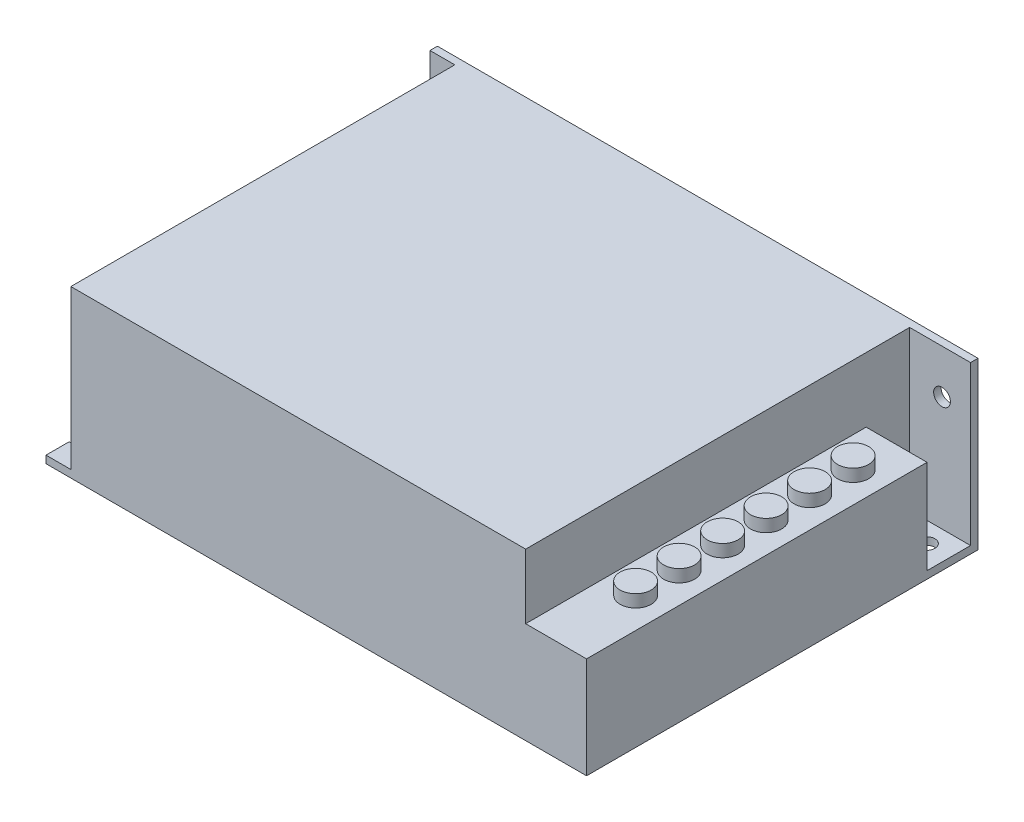
ISO-10303-21;
HEADER;
FILE_DESCRIPTION(('STEP AP214'),'2;1');
FILE_NAME('part.step','',(''),(''),'','','');
FILE_SCHEMA(('AUTOMOTIVE_DESIGN { 1 0 10303 214 1 1 1 1 }'));
ENDSEC;
DATA;
#1=APPLICATION_CONTEXT('core data for automotive mechanical design processes');
#2=APPLICATION_PROTOCOL_DEFINITION('international standard','automotive_design',2000,#1);
#3=PRODUCT_CONTEXT('',#1,'mechanical');
#4=PRODUCT('Part','Part','',(#3));
#5=PRODUCT_RELATED_PRODUCT_CATEGORY('part','',(#4));
#6=PRODUCT_DEFINITION_FORMATION('','',#4);
#7=PRODUCT_DEFINITION_CONTEXT('part definition',#1,'design');
#8=PRODUCT_DEFINITION('design','',#6,#7);
#9=PRODUCT_DEFINITION_SHAPE('','',#8);
#10=(LENGTH_UNIT() NAMED_UNIT(*) SI_UNIT(.MILLI.,.METRE.));
#11=(NAMED_UNIT(*) PLANE_ANGLE_UNIT() SI_UNIT($,.RADIAN.));
#12=(NAMED_UNIT(*) SI_UNIT($,.STERADIAN.) SOLID_ANGLE_UNIT());
#13=UNCERTAINTY_MEASURE_WITH_UNIT(LENGTH_MEASURE(1.E-05),#10,'distance_accuracy_value','');
#14=(GEOMETRIC_REPRESENTATION_CONTEXT(3) GLOBAL_UNCERTAINTY_ASSIGNED_CONTEXT((#13)) GLOBAL_UNIT_ASSIGNED_CONTEXT((#10,
#11,#12)) REPRESENTATION_CONTEXT('',''));
#15=CARTESIAN_POINT('',(0.,0.,0.));
#16=DIRECTION('',(0.,0.,1.));
#17=DIRECTION('',(1.,0.,0.));
#18=AXIS2_PLACEMENT_3D('',#15,#16,#17);
#19=CARTESIAN_POINT('',(0.,20.701,0.));
#20=DIRECTION('',(0.,1.,0.));
#21=DIRECTION('',(0.,0.,1.));
#22=AXIS2_PLACEMENT_3D('',#19,#20,#21);
#23=PLANE('',#22);
#24=CARTESIAN_POINT('',(49.022,20.701,-20.701));
#25=DIRECTION('',(0.,1.,0.));
#26=DIRECTION('',(0.,0.,1.));
#27=AXIS2_PLACEMENT_3D('',#24,#25,#26);
#28=CIRCLE('',#27,3.175);
#29=CARTESIAN_POINT('',(49.022,20.701,-17.526));
#30=VERTEX_POINT('',#29);
#31=EDGE_CURVE('E213',#30,#30,#28,.T.);
#32=ORIENTED_EDGE('',*,*,#31,.F.);
#33=EDGE_LOOP('',(#32));
#34=FACE_BOUND('',#33,.T.);
#35=DIRECTION('',(1.,0.,0.));
#36=VECTOR('',#35,1.);
#37=CARTESIAN_POINT('',(21.6616059080122,20.701,-29.591));
#38=LINE('',#37,#36);
#39=CARTESIAN_POINT('',(42.799,20.701,-29.591));
#40=VERTEX_POINT('',#39);
#41=CARTESIAN_POINT('',(55.245,20.701,-29.591));
#42=VERTEX_POINT('',#41);
#43=EDGE_CURVE('E313',#40,#42,#38,.T.);
#44=ORIENTED_EDGE('',*,*,#43,.F.);
#45=DIRECTION('',(0.,0.,1.));
#46=VECTOR('',#45,1.);
#47=CARTESIAN_POINT('',(42.799,20.701,-38.481));
#48=LINE('',#47,#46);
#49=CARTESIAN_POINT('',(42.799,20.701,40.005));
#50=VERTEX_POINT('',#49);
#51=EDGE_CURVE('E329',#40,#50,#48,.T.);
#52=ORIENTED_EDGE('',*,*,#51,.T.);
#53=DIRECTION('',(1.,0.,0.));
#54=VECTOR('',#53,1.);
#55=CARTESIAN_POINT('',(42.799,20.701,40.005));
#56=LINE('',#55,#54);
#57=CARTESIAN_POINT('',(55.245,20.701,40.005));
#58=VERTEX_POINT('',#57);
#59=EDGE_CURVE('E331',#50,#58,#56,.T.);
#60=ORIENTED_EDGE('',*,*,#59,.T.);
#61=DIRECTION('',(0.,0.,-1.));
#62=VECTOR('',#61,1.);
#63=CARTESIAN_POINT('',(55.245,20.701,-38.481));
#64=LINE('',#63,#62);
#65=EDGE_CURVE('E334',#58,#42,#64,.T.);
#66=ORIENTED_EDGE('',*,*,#65,.T.);
#67=EDGE_LOOP('',(#44,#52,#60,#66));
#68=FACE_BOUND('',#67,.T.);
#69=CARTESIAN_POINT('',(49.022,20.701,-11.811));
#70=DIRECTION('',(0.,1.,0.));
#71=DIRECTION('',(0.,0.,1.));
#72=AXIS2_PLACEMENT_3D('',#69,#70,#71);
#73=CIRCLE('',#72,3.175);
#74=CARTESIAN_POINT('',(49.022,20.701,-8.63600000000002));
#75=VERTEX_POINT('',#74);
#76=EDGE_CURVE('E207',#75,#75,#73,.T.);
#77=ORIENTED_EDGE('',*,*,#76,.F.);
#78=EDGE_LOOP('',(#77));
#79=FACE_BOUND('',#78,.T.);
#80=CARTESIAN_POINT('',(49.022,20.701,-2.92100000000002));
#81=DIRECTION('',(0.,1.,0.));
#82=DIRECTION('',(0.,0.,1.));
#83=AXIS2_PLACEMENT_3D('',#80,#81,#82);
#84=CIRCLE('',#83,3.175);
#85=CARTESIAN_POINT('',(49.022,20.701,0.253999999999977));
#86=VERTEX_POINT('',#85);
#87=EDGE_CURVE('E392',#86,#86,#84,.T.);
#88=ORIENTED_EDGE('',*,*,#87,.F.);
#89=EDGE_LOOP('',(#88));
#90=FACE_BOUND('',#89,.T.);
#91=CARTESIAN_POINT('',(49.022,20.701,5.96899999999998));
#92=DIRECTION('',(0.,1.,0.));
#93=DIRECTION('',(0.,0.,1.));
#94=AXIS2_PLACEMENT_3D('',#91,#92,#93);
#95=CIRCLE('',#94,3.175);
#96=CARTESIAN_POINT('',(49.022,20.701,9.14399999999998));
#97=VERTEX_POINT('',#96);
#98=EDGE_CURVE('E398',#97,#97,#95,.T.);
#99=ORIENTED_EDGE('',*,*,#98,.F.);
#100=EDGE_LOOP('',(#99));
#101=FACE_BOUND('',#100,.T.);
#102=CARTESIAN_POINT('',(49.022,20.701,14.859));
#103=DIRECTION('',(0.,1.,0.));
#104=DIRECTION('',(0.,0.,1.));
#105=AXIS2_PLACEMENT_3D('',#102,#103,#104);
#106=CIRCLE('',#105,3.175);
#107=CARTESIAN_POINT('',(49.022,20.701,18.034));
#108=VERTEX_POINT('',#107);
#109=EDGE_CURVE('E404',#108,#108,#106,.T.);
#110=ORIENTED_EDGE('',*,*,#109,.F.);
#111=EDGE_LOOP('',(#110));
#112=FACE_BOUND('',#111,.T.);
#113=CARTESIAN_POINT('',(49.022,20.701,23.749));
#114=DIRECTION('',(0.,1.,0.));
#115=DIRECTION('',(0.,0.,1.));
#116=AXIS2_PLACEMENT_3D('',#113,#114,#115);
#117=CIRCLE('',#116,3.175);
#118=CARTESIAN_POINT('',(49.022,20.701,26.924));
#119=VERTEX_POINT('',#118);
#120=EDGE_CURVE('E40',#119,#119,#117,.T.);
#121=ORIENTED_EDGE('',*,*,#120,.F.);
#122=EDGE_LOOP('',(#121));
#123=FACE_BOUND('',#122,.T.);
#124=ADVANCED_FACE('F32',(#34,#68,#79,#90,#101,#112,#123),#23,.T.);
#125=CARTESIAN_POINT('',(-55.245,33.909,-40.005));
#126=DIRECTION('',(1.,0.,0.));
#127=DIRECTION('',(0.,0.,-1.));
#128=AXIS2_PLACEMENT_3D('',#125,#126,#127);
#129=PLANE('',#128);
#130=DIRECTION('',(0.,0.,1.));
#131=VECTOR('',#130,1.);
#132=CARTESIAN_POINT('',(-55.245,0.,-40.005));
#133=LINE('',#132,#131);
#134=CARTESIAN_POINT('',(-55.245,0.,-40.005));
#135=VERTEX_POINT('',#134);
#136=CARTESIAN_POINT('',(-55.245,0.,32.1056));
#137=VERTEX_POINT('',#136);
#138=EDGE_CURVE('E366',#135,#137,#133,.T.);
#139=ORIENTED_EDGE('',*,*,#138,.T.);
#140=DIRECTION('',(0.,-1.,0.));
#141=VECTOR('',#140,1.);
#142=CARTESIAN_POINT('',(-55.245,33.909,32.1056));
#143=LINE('',#142,#141);
#144=CARTESIAN_POINT('',(-55.245,1.524,32.1056));
#145=VERTEX_POINT('',#144);
#146=EDGE_CURVE('E231',#145,#137,#143,.T.);
#147=ORIENTED_EDGE('',*,*,#146,.F.);
#148=DIRECTION('',(0.,0.,1.));
#149=VECTOR('',#148,1.);
#150=CARTESIAN_POINT('',(-55.245,1.524,29.845));
#151=LINE('',#150,#149);
#152=CARTESIAN_POINT('',(-55.245,1.524,29.845));
#153=VERTEX_POINT('',#152);
#154=EDGE_CURVE('E271',#153,#145,#151,.T.);
#155=ORIENTED_EDGE('',*,*,#154,.F.);
#156=DIRECTION('',(0.,-1.,0.));
#157=VECTOR('',#156,1.);
#158=CARTESIAN_POINT('',(-55.245,13.462,29.845));
#159=LINE('',#158,#157);
#160=CARTESIAN_POINT('',(-55.245,13.462,29.845));
#161=VERTEX_POINT('',#160);
#162=EDGE_CURVE('E292',#161,#153,#159,.T.);
#163=ORIENTED_EDGE('',*,*,#162,.F.);
#164=DIRECTION('',(0.,0.,1.));
#165=VECTOR('',#164,1.);
#166=CARTESIAN_POINT('',(-55.245,13.462,-38.481));
#167=LINE('',#166,#165);
#168=CARTESIAN_POINT('',(-55.245,13.462,-38.481));
#169=VERTEX_POINT('',#168);
#170=EDGE_CURVE('E289',#169,#161,#167,.T.);
#171=ORIENTED_EDGE('',*,*,#170,.F.);
#172=DIRECTION('',(0.,-1.,0.));
#173=VECTOR('',#172,1.);
#174=CARTESIAN_POINT('',(-55.245,33.909,-38.481));
#175=LINE('',#174,#173);
#176=CARTESIAN_POINT('',(-55.245,23.2918,-38.481));
#177=VERTEX_POINT('',#176);
#178=EDGE_CURVE('E266',#177,#169,#175,.T.);
#179=ORIENTED_EDGE('',*,*,#178,.F.);
#180=DIRECTION('',(0.,0.,-1.));
#181=VECTOR('',#180,1.);
#182=CARTESIAN_POINT('',(-55.245,23.2918,40.006));
#183=LINE('',#182,#181);
#184=CARTESIAN_POINT('',(-55.245,23.2918,-40.005));
#185=VERTEX_POINT('',#184);
#186=EDGE_CURVE('E55',#177,#185,#183,.T.);
#187=ORIENTED_EDGE('',*,*,#186,.T.);
#188=DIRECTION('',(0.,-1.,0.));
#189=VECTOR('',#188,1.);
#190=CARTESIAN_POINT('',(-55.245,33.909,-40.005));
#191=LINE('',#190,#189);
#192=EDGE_CURVE('E375',#185,#135,#191,.T.);
#193=ORIENTED_EDGE('',*,*,#192,.T.);
#194=EDGE_LOOP('',(#139,#147,#155,#163,#171,#179,#187,#193));
#195=FACE_BOUND('',#194,.T.);
#196=ADVANCED_FACE('F415',(#195),#129,.F.);
#197=CARTESIAN_POINT('',(-55.245,33.909,-40.005));
#198=VERTEX_POINT('',#197);
#199=CARTESIAN_POINT('',(-55.245,26.543,-40.005));
#200=VERTEX_POINT('',#199);
#201=EDGE_CURVE('E376',#198,#200,#191,.T.);
#202=ORIENTED_EDGE('',*,*,#201,.T.);
#203=DIRECTION('',(0.,0.,-1.));
#204=VECTOR('',#203,1.);
#205=CARTESIAN_POINT('',(-55.245,26.543,40.006));
#206=LINE('',#205,#204);
#207=CARTESIAN_POINT('',(-55.245,26.543,-38.481));
#208=VERTEX_POINT('',#207);
#209=EDGE_CURVE('E255',#208,#200,#206,.T.);
#210=ORIENTED_EDGE('',*,*,#209,.F.);
#211=CARTESIAN_POINT('',(-55.245,33.909,-38.481));
#212=VERTEX_POINT('',#211);
#213=EDGE_CURVE('E286',#212,#208,#175,.T.);
#214=ORIENTED_EDGE('',*,*,#213,.F.);
#215=DIRECTION('',(0.,0.,1.));
#216=VECTOR('',#215,1.);
#217=CARTESIAN_POINT('',(-55.245,33.909,-40.005));
#218=LINE('',#217,#216);
#219=EDGE_CURVE('E354',#198,#212,#218,.T.);
#220=ORIENTED_EDGE('',*,*,#219,.F.);
#221=EDGE_LOOP('',(#202,#210,#214,#220));
#222=FACE_BOUND('',#221,.T.);
#223=ADVANCED_FACE('F421',(#222),#129,.F.);
#224=CARTESIAN_POINT('',(55.245,33.909,-40.005));
#225=DIRECTION('',(-1.,0.,0.));
#226=DIRECTION('',(0.,0.,1.));
#227=AXIS2_PLACEMENT_3D('',#224,#225,#226);
#228=PLANE('',#227);
#229=DIRECTION('',(0.,0.,-1.));
#230=VECTOR('',#229,1.);
#231=CARTESIAN_POINT('',(55.245,1.524,-38.481));
#232=LINE('',#231,#230);
#233=CARTESIAN_POINT('',(55.245,1.524,-29.591));
#234=VERTEX_POINT('',#233);
#235=CARTESIAN_POINT('',(55.245,1.524,-38.481));
#236=VERTEX_POINT('',#235);
#237=EDGE_CURVE('E310',#234,#236,#232,.T.);
#238=ORIENTED_EDGE('',*,*,#237,.F.);
#239=DIRECTION('',(0.,-1.,0.));
#240=VECTOR('',#239,1.);
#241=CARTESIAN_POINT('',(55.245,20.701,-29.591));
#242=LINE('',#241,#240);
#243=EDGE_CURVE('E300',#42,#234,#242,.T.);
#244=ORIENTED_EDGE('',*,*,#243,.F.);
#245=ORIENTED_EDGE('',*,*,#65,.F.);
#246=DIRECTION('',(0.,-1.,0.));
#247=VECTOR('',#246,1.);
#248=CARTESIAN_POINT('',(55.245,33.909,40.005));
#249=LINE('',#248,#247);
#250=CARTESIAN_POINT('',(55.245,0.,40.005));
#251=VERTEX_POINT('',#250);
#252=EDGE_CURVE('E359',#58,#251,#249,.T.);
#253=ORIENTED_EDGE('',*,*,#252,.T.);
#254=DIRECTION('',(0.,0.,-1.));
#255=VECTOR('',#254,1.);
#256=CARTESIAN_POINT('',(55.245,0.,-40.005));
#257=LINE('',#256,#255);
#258=CARTESIAN_POINT('',(55.245,0.,-40.005));
#259=VERTEX_POINT('',#258);
#260=EDGE_CURVE('E344',#251,#259,#257,.T.);
#261=ORIENTED_EDGE('',*,*,#260,.T.);
#262=DIRECTION('',(0.,-1.,0.));
#263=VECTOR('',#262,1.);
#264=CARTESIAN_POINT('',(55.245,33.909,-40.005));
#265=LINE('',#264,#263);
#266=CARTESIAN_POINT('',(55.245,33.909,-40.005));
#267=VERTEX_POINT('',#266);
#268=EDGE_CURVE('E379',#267,#259,#265,.T.);
#269=ORIENTED_EDGE('',*,*,#268,.F.);
#270=DIRECTION('',(0.,0.,-1.));
#271=VECTOR('',#270,1.);
#272=CARTESIAN_POINT('',(55.245,33.909,-40.005));
#273=LINE('',#272,#271);
#274=CARTESIAN_POINT('',(55.245,33.909,-38.481));
#275=VERTEX_POINT('',#274);
#276=EDGE_CURVE('E349',#275,#267,#273,.T.);
#277=ORIENTED_EDGE('',*,*,#276,.F.);
#278=DIRECTION('',(0.,1.,0.));
#279=VECTOR('',#278,1.);
#280=CARTESIAN_POINT('',(55.245,20.701,-38.481));
#281=LINE('',#280,#279);
#282=EDGE_CURVE('E345',#236,#275,#281,.T.);
#283=ORIENTED_EDGE('',*,*,#282,.F.);
#284=EDGE_LOOP('',(#238,#244,#245,#253,#261,#269,#277,#283));
#285=FACE_BOUND('',#284,.T.);
#286=ADVANCED_FACE('F456',(#285),#228,.F.);
#287=CARTESIAN_POINT('',(-55.245,33.909,-40.005));
#288=DIRECTION('',(0.,0.,1.));
#289=DIRECTION('',(1.,0.,0.));
#290=AXIS2_PLACEMENT_3D('',#287,#288,#289);
#291=PLANE('',#290);
#292=CARTESIAN_POINT('',(49.4157,24.9047,-40.005));
#293=DIRECTION('',(0.,0.,-1.));
#294=DIRECTION('',(-1.,0.,0.));
#295=AXIS2_PLACEMENT_3D('',#292,#293,#294);
#296=CIRCLE('',#295,1.7145);
#297=CARTESIAN_POINT('',(47.7012,24.9047,-40.005));
#298=VERTEX_POINT('',#297);
#299=EDGE_CURVE('E260',#298,#298,#296,.T.);
#300=ORIENTED_EDGE('',*,*,#299,.F.);
#301=EDGE_LOOP('',(#300));
#302=FACE_BOUND('',#301,.T.);
#303=CARTESIAN_POINT('',(-51.816,24.9174,-40.005));
#304=DIRECTION('',(0.,0.,-1.));
#305=DIRECTION('',(-1.,0.,0.));
#306=AXIS2_PLACEMENT_3D('',#303,#304,#305);
#307=CIRCLE('',#306,1.6256);
#308=CARTESIAN_POINT('',(-51.816,26.543,-40.005));
#309=VERTEX_POINT('',#308);
#310=CARTESIAN_POINT('',(-51.816,23.2918,-40.005));
#311=VERTEX_POINT('',#310);
#312=EDGE_CURVE('E243',#309,#311,#307,.T.);
#313=ORIENTED_EDGE('',*,*,#312,.F.);
#314=DIRECTION('',(1.,0.,0.));
#315=VECTOR('',#314,1.);
#316=CARTESIAN_POINT('',(-51.816,26.543,-40.005));
#317=LINE('',#316,#315);
#318=EDGE_CURVE('E248',#200,#309,#317,.T.);
#319=ORIENTED_EDGE('',*,*,#318,.F.);
#320=ORIENTED_EDGE('',*,*,#201,.F.);
#321=DIRECTION('',(-1.,0.,0.));
#322=VECTOR('',#321,1.);
#323=CARTESIAN_POINT('',(-55.245,33.909,-40.005));
#324=LINE('',#323,#322);
#325=EDGE_CURVE('E351',#267,#198,#324,.T.);
#326=ORIENTED_EDGE('',*,*,#325,.F.);
#327=ORIENTED_EDGE('',*,*,#268,.T.);
#328=DIRECTION('',(-1.,0.,0.));
#329=VECTOR('',#328,1.);
#330=CARTESIAN_POINT('',(-55.245,0.,-40.005));
#331=LINE('',#330,#329);
#332=EDGE_CURVE('E362',#259,#135,#331,.T.);
#333=ORIENTED_EDGE('',*,*,#332,.T.);
#334=ORIENTED_EDGE('',*,*,#192,.F.);
#335=DIRECTION('',(-1.,0.,0.));
#336=VECTOR('',#335,1.);
#337=CARTESIAN_POINT('',(-51.816,23.2918,-40.005));
#338=LINE('',#337,#336);
#339=EDGE_CURVE('E246',#311,#185,#338,.T.);
#340=ORIENTED_EDGE('',*,*,#339,.F.);
#341=EDGE_LOOP('',(#313,#319,#320,#326,#327,#333,#334,#340));
#342=FACE_BOUND('',#341,.T.);
#343=ADVANCED_FACE('F452',(#302,#342),#291,.F.);
#344=CARTESIAN_POINT('',(-55.245,1.524,35.2806));
#345=VERTEX_POINT('',#344);
#346=CARTESIAN_POINT('',(-55.245,1.524,40.005));
#347=VERTEX_POINT('',#346);
#348=EDGE_CURVE('E295',#345,#347,#151,.T.);
#349=ORIENTED_EDGE('',*,*,#348,.F.);
#350=DIRECTION('',(0.,-1.,0.));
#351=VECTOR('',#350,1.);
#352=CARTESIAN_POINT('',(-55.245,33.909,35.2806));
#353=LINE('',#352,#351);
#354=CARTESIAN_POINT('',(-55.245,0.,35.2806));
#355=VERTEX_POINT('',#354);
#356=EDGE_CURVE('E47',#345,#355,#353,.T.);
#357=ORIENTED_EDGE('',*,*,#356,.T.);
#358=CARTESIAN_POINT('',(-55.245,0.,40.005));
#359=VERTEX_POINT('',#358);
#360=EDGE_CURVE('E365',#355,#359,#133,.T.);
#361=ORIENTED_EDGE('',*,*,#360,.T.);
#362=DIRECTION('',(0.,-1.,0.));
#363=VECTOR('',#362,1.);
#364=CARTESIAN_POINT('',(-55.245,33.909,40.005));
#365=LINE('',#364,#363);
#366=EDGE_CURVE('E372',#347,#359,#365,.T.);
#367=ORIENTED_EDGE('',*,*,#366,.F.);
#368=EDGE_LOOP('',(#349,#357,#361,#367));
#369=FACE_BOUND('',#368,.T.);
#370=ADVANCED_FACE('F424',(#369),#129,.F.);
#371=CARTESIAN_POINT('',(-55.245,33.909,40.005));
#372=DIRECTION('',(0.,0.,-1.));
#373=DIRECTION('',(-1.,0.,0.));
#374=AXIS2_PLACEMENT_3D('',#371,#372,#373);
#375=PLANE('',#374);
#376=DIRECTION('',(0.,1.,0.));
#377=VECTOR('',#376,1.);
#378=CARTESIAN_POINT('',(-50.165,33.909,40.005));
#379=LINE('',#378,#377);
#380=CARTESIAN_POINT('',(-50.165,1.524,40.005));
#381=VERTEX_POINT('',#380);
#382=CARTESIAN_POINT('',(-50.165,33.909,40.005));
#383=VERTEX_POINT('',#382);
#384=EDGE_CURVE('E280',#381,#383,#379,.T.);
#385=ORIENTED_EDGE('',*,*,#384,.F.);
#386=DIRECTION('',(-1.,0.,0.));
#387=VECTOR('',#386,1.);
#388=CARTESIAN_POINT('',(-50.165,1.524,40.005));
#389=LINE('',#388,#387);
#390=EDGE_CURVE('E301',#381,#347,#389,.T.);
#391=ORIENTED_EDGE('',*,*,#390,.T.);
#392=ORIENTED_EDGE('',*,*,#366,.T.);
#393=DIRECTION('',(1.,0.,0.));
#394=VECTOR('',#393,1.);
#395=CARTESIAN_POINT('',(-55.245,0.,40.005));
#396=LINE('',#395,#394);
#397=EDGE_CURVE('E352',#359,#251,#396,.T.);
#398=ORIENTED_EDGE('',*,*,#397,.T.);
#399=ORIENTED_EDGE('',*,*,#252,.F.);
#400=ORIENTED_EDGE('',*,*,#59,.F.);
#401=DIRECTION('',(0.,1.,0.));
#402=VECTOR('',#401,1.);
#403=CARTESIAN_POINT('',(42.799,20.701,40.005));
#404=LINE('',#403,#402);
#405=CARTESIAN_POINT('',(42.799,33.909,40.005));
#406=VERTEX_POINT('',#405);
#407=EDGE_CURVE('E337',#50,#406,#404,.T.);
#408=ORIENTED_EDGE('',*,*,#407,.T.);
#409=DIRECTION('',(1.,0.,0.));
#410=VECTOR('',#409,1.);
#411=CARTESIAN_POINT('',(-55.245,33.909,40.005));
#412=LINE('',#411,#410);
#413=EDGE_CURVE('E357',#383,#406,#412,.T.);
#414=ORIENTED_EDGE('',*,*,#413,.F.);
#415=EDGE_LOOP('',(#385,#391,#392,#398,#399,#400,#408,#414));
#416=FACE_BOUND('',#415,.T.);
#417=ADVANCED_FACE('F443',(#416),#375,.F.);
#418=CARTESIAN_POINT('',(0.,33.909,0.));
#419=DIRECTION('',(0.,1.,0.));
#420=DIRECTION('',(0.,0.,1.));
#421=AXIS2_PLACEMENT_3D('',#418,#419,#420);
#422=PLANE('',#421);
#423=DIRECTION('',(-1.,0.,0.));
#424=VECTOR('',#423,1.);
#425=CARTESIAN_POINT('',(-50.165,33.909,-38.481));
#426=LINE('',#425,#424);
#427=CARTESIAN_POINT('',(-50.165,33.909,-38.481));
#428=VERTEX_POINT('',#427);
#429=EDGE_CURVE('E298',#428,#212,#426,.T.);
#430=ORIENTED_EDGE('',*,*,#429,.F.);
#431=DIRECTION('',(0.,0.,-1.));
#432=VECTOR('',#431,1.);
#433=CARTESIAN_POINT('',(-50.165,33.909,-38.481));
#434=LINE('',#433,#432);
#435=EDGE_CURVE('E282',#383,#428,#434,.T.);
#436=ORIENTED_EDGE('',*,*,#435,.F.);
#437=ORIENTED_EDGE('',*,*,#413,.T.);
#438=DIRECTION('',(0.,0.,1.));
#439=VECTOR('',#438,1.);
#440=CARTESIAN_POINT('',(42.799,33.909,-38.481));
#441=LINE('',#440,#439);
#442=CARTESIAN_POINT('',(42.799,33.909,-38.481));
#443=VERTEX_POINT('',#442);
#444=EDGE_CURVE('E326',#443,#406,#441,.T.);
#445=ORIENTED_EDGE('',*,*,#444,.F.);
#446=DIRECTION('',(-1.,0.,0.));
#447=VECTOR('',#446,1.);
#448=CARTESIAN_POINT('',(42.799,33.909,-38.481));
#449=LINE('',#448,#447);
#450=EDGE_CURVE('E332',#275,#443,#449,.T.);
#451=ORIENTED_EDGE('',*,*,#450,.F.);
#452=ORIENTED_EDGE('',*,*,#276,.T.);
#453=ORIENTED_EDGE('',*,*,#325,.T.);
#454=ORIENTED_EDGE('',*,*,#219,.T.);
#455=EDGE_LOOP('',(#430,#436,#437,#445,#451,#452,#453,#454));
#456=FACE_BOUND('',#455,.T.);
#457=ADVANCED_FACE('F440',(#456),#422,.T.);
#458=CARTESIAN_POINT('',(0.,0.,0.));
#459=DIRECTION('',(0.,1.,0.));
#460=DIRECTION('',(0.,0.,1.));
#461=AXIS2_PLACEMENT_3D('',#458,#459,#460);
#462=PLANE('',#461);
#463=CARTESIAN_POINT('',(39.8936,0.,12.6719));
#464=DIRECTION('',(0.,-1.,0.));
#465=DIRECTION('',(0.,0.,-1.));
#466=AXIS2_PLACEMENT_3D('',#463,#464,#465);
#467=CIRCLE('',#466,1.69999999999999);
#468=CARTESIAN_POINT('',(39.8936,0.,10.9719));
#469=VERTEX_POINT('',#468);
#470=EDGE_CURVE('E197',#469,#469,#467,.T.);
#471=ORIENTED_EDGE('',*,*,#470,.F.);
#472=EDGE_LOOP('',(#471));
#473=FACE_BOUND('',#472,.T.);
#474=CARTESIAN_POINT('',(-20.1064,0.,12.6719));
#475=DIRECTION('',(0.,-1.,0.));
#476=DIRECTION('',(0.,0.,-1.));
#477=AXIS2_PLACEMENT_3D('',#474,#475,#476);
#478=CIRCLE('',#477,1.69999999999999);
#479=CARTESIAN_POINT('',(-20.1064,0.,10.9719));
#480=VERTEX_POINT('',#479);
#481=EDGE_CURVE('E196',#480,#480,#478,.T.);
#482=ORIENTED_EDGE('',*,*,#481,.F.);
#483=EDGE_LOOP('',(#482));
#484=FACE_BOUND('',#483,.T.);
#485=CARTESIAN_POINT('',(50.3936,0.,-34.3281));
#486=DIRECTION('',(0.,-1.,0.));
#487=DIRECTION('',(0.,0.,-1.));
#488=AXIS2_PLACEMENT_3D('',#485,#486,#487);
#489=CIRCLE('',#488,1.7145);
#490=CARTESIAN_POINT('',(50.3936,0.,-36.0426));
#491=VERTEX_POINT('',#490);
#492=EDGE_CURVE('E230',#491,#491,#489,.T.);
#493=ORIENTED_EDGE('',*,*,#492,.F.);
#494=EDGE_LOOP('',(#493));
#495=FACE_BOUND('',#494,.T.);
#496=CARTESIAN_POINT('',(-51.816,0.,33.6931));
#497=DIRECTION('',(0.,-1.,0.));
#498=DIRECTION('',(0.,0.,-1.));
#499=AXIS2_PLACEMENT_3D('',#496,#497,#498);
#500=CIRCLE('',#499,1.5875);
#501=CARTESIAN_POINT('',(-51.816,0.,32.1056));
#502=VERTEX_POINT('',#501);
#503=CARTESIAN_POINT('',(-51.816,0.,35.2806));
#504=VERTEX_POINT('',#503);
#505=EDGE_CURVE('E217',#502,#504,#500,.T.);
#506=ORIENTED_EDGE('',*,*,#505,.F.);
#507=DIRECTION('',(1.,0.,0.));
#508=VECTOR('',#507,1.);
#509=CARTESIAN_POINT('',(-55.245,0.,32.1056));
#510=LINE('',#509,#508);
#511=EDGE_CURVE('E224',#137,#502,#510,.T.);
#512=ORIENTED_EDGE('',*,*,#511,.F.);
#513=ORIENTED_EDGE('',*,*,#138,.F.);
#514=ORIENTED_EDGE('',*,*,#332,.F.);
#515=ORIENTED_EDGE('',*,*,#260,.F.);
#516=ORIENTED_EDGE('',*,*,#397,.F.);
#517=ORIENTED_EDGE('',*,*,#360,.F.);
#518=DIRECTION('',(-1.,0.,0.));
#519=VECTOR('',#518,1.);
#520=CARTESIAN_POINT('',(-51.816,0.,35.2806));
#521=LINE('',#520,#519);
#522=EDGE_CURVE('E222',#504,#355,#521,.T.);
#523=ORIENTED_EDGE('',*,*,#522,.F.);
#524=EDGE_LOOP('',(#506,#512,#513,#514,#515,#516,#517,#523));
#525=FACE_BOUND('',#524,.T.);
#526=ADVANCED_FACE('F438',(#473,#484,#495,#525),#462,.F.);
#527=CARTESIAN_POINT('',(42.799,20.701,-38.481));
#528=DIRECTION('',(-1.,0.,0.));
#529=DIRECTION('',(0.,0.,1.));
#530=AXIS2_PLACEMENT_3D('',#527,#528,#529);
#531=PLANE('',#530);
#532=ORIENTED_EDGE('',*,*,#444,.T.);
#533=ORIENTED_EDGE('',*,*,#407,.F.);
#534=ORIENTED_EDGE('',*,*,#51,.F.);
#535=DIRECTION('',(0.,-1.,0.));
#536=VECTOR('',#535,1.);
#537=CARTESIAN_POINT('',(42.799,20.701,-29.591));
#538=LINE('',#537,#536);
#539=CARTESIAN_POINT('',(42.799,1.524,-29.591));
#540=VERTEX_POINT('',#539);
#541=EDGE_CURVE('E321',#40,#540,#538,.T.);
#542=ORIENTED_EDGE('',*,*,#541,.T.);
#543=DIRECTION('',(0.,0.,-1.));
#544=VECTOR('',#543,1.);
#545=CARTESIAN_POINT('',(42.799,1.524,-38.481));
#546=LINE('',#545,#544);
#547=CARTESIAN_POINT('',(42.799,1.524,-38.481));
#548=VERTEX_POINT('',#547);
#549=EDGE_CURVE('E316',#540,#548,#546,.T.);
#550=ORIENTED_EDGE('',*,*,#549,.T.);
#551=DIRECTION('',(0.,1.,0.));
#552=VECTOR('',#551,1.);
#553=CARTESIAN_POINT('',(42.799,20.701,-38.481));
#554=LINE('',#553,#552);
#555=EDGE_CURVE('E342',#548,#443,#554,.T.);
#556=ORIENTED_EDGE('',*,*,#555,.T.);
#557=EDGE_LOOP('',(#532,#533,#534,#542,#550,#556));
#558=FACE_BOUND('',#557,.T.);
#559=ADVANCED_FACE('F434',(#558),#531,.F.);
#560=CARTESIAN_POINT('',(42.799,20.701,-38.481));
#561=DIRECTION('',(0.,0.,-1.));
#562=DIRECTION('',(-1.,0.,0.));
#563=AXIS2_PLACEMENT_3D('',#560,#561,#562);
#564=PLANE('',#563);
#565=CARTESIAN_POINT('',(49.4157,24.9047,-38.481));
#566=DIRECTION('',(0.,0.,-1.));
#567=DIRECTION('',(-1.,0.,0.));
#568=AXIS2_PLACEMENT_3D('',#565,#566,#567);
#569=CIRCLE('',#568,1.7145);
#570=CARTESIAN_POINT('',(47.7012,24.9047,-38.481));
#571=VERTEX_POINT('',#570);
#572=EDGE_CURVE('E263',#571,#571,#569,.F.);
#573=ORIENTED_EDGE('',*,*,#572,.F.);
#574=EDGE_LOOP('',(#573));
#575=FACE_BOUND('',#574,.T.);
#576=ORIENTED_EDGE('',*,*,#450,.T.);
#577=ORIENTED_EDGE('',*,*,#555,.F.);
#578=DIRECTION('',(1.,0.,0.));
#579=VECTOR('',#578,1.);
#580=CARTESIAN_POINT('',(21.6616059080122,1.524,-38.481));
#581=LINE('',#580,#579);
#582=EDGE_CURVE('E319',#548,#236,#581,.T.);
#583=ORIENTED_EDGE('',*,*,#582,.T.);
#584=ORIENTED_EDGE('',*,*,#282,.T.);
#585=EDGE_LOOP('',(#576,#577,#583,#584));
#586=FACE_BOUND('',#585,.T.);
#587=ADVANCED_FACE('F431',(#575,#586),#564,.F.);
#588=CARTESIAN_POINT('',(21.6616059080122,20.701,-29.591));
#589=DIRECTION('',(0.,0.,1.));
#590=DIRECTION('',(1.,0.,0.));
#591=AXIS2_PLACEMENT_3D('',#588,#589,#590);
#592=PLANE('',#591);
#593=ORIENTED_EDGE('',*,*,#43,.T.);
#594=ORIENTED_EDGE('',*,*,#243,.T.);
#595=DIRECTION('',(1.,0.,0.));
#596=VECTOR('',#595,1.);
#597=CARTESIAN_POINT('',(21.6616059080122,1.524,-29.591));
#598=LINE('',#597,#596);
#599=EDGE_CURVE('E320',#540,#234,#598,.T.);
#600=ORIENTED_EDGE('',*,*,#599,.F.);
#601=ORIENTED_EDGE('',*,*,#541,.F.);
#602=EDGE_LOOP('',(#593,#594,#600,#601));
#603=FACE_BOUND('',#602,.T.);
#604=ADVANCED_FACE('F429',(#603),#592,.F.);
#605=CARTESIAN_POINT('',(21.6616059080122,1.524,-38.481));
#606=DIRECTION('',(0.,-1.,0.));
#607=DIRECTION('',(0.,0.,-1.));
#608=AXIS2_PLACEMENT_3D('',#605,#606,#607);
#609=PLANE('',#608);
#610=CARTESIAN_POINT('',(50.3936,1.524,-34.3281));
#611=DIRECTION('',(0.,-1.,0.));
#612=DIRECTION('',(0.,0.,-1.));
#613=AXIS2_PLACEMENT_3D('',#610,#611,#612);
#614=CIRCLE('',#613,1.7145);
#615=CARTESIAN_POINT('',(50.3936,1.524,-36.0426));
#616=VERTEX_POINT('',#615);
#617=EDGE_CURVE('E237',#616,#616,#614,.T.);
#618=ORIENTED_EDGE('',*,*,#617,.T.);
#619=EDGE_LOOP('',(#618));
#620=FACE_BOUND('',#619,.T.);
#621=ORIENTED_EDGE('',*,*,#599,.T.);
#622=ORIENTED_EDGE('',*,*,#237,.T.);
#623=ORIENTED_EDGE('',*,*,#582,.F.);
#624=ORIENTED_EDGE('',*,*,#549,.F.);
#625=EDGE_LOOP('',(#621,#622,#623,#624));
#626=FACE_BOUND('',#625,.T.);
#627=ADVANCED_FACE('F658',(#620,#626),#609,.F.);
#628=CARTESIAN_POINT('',(-50.165,33.909,-38.481));
#629=DIRECTION('',(0.,0.,-1.));
#630=DIRECTION('',(-1.,0.,0.));
#631=AXIS2_PLACEMENT_3D('',#628,#629,#630);
#632=PLANE('',#631);
#633=ORIENTED_EDGE('',*,*,#213,.T.);
#634=DIRECTION('',(-1.,0.,0.));
#635=VECTOR('',#634,1.);
#636=CARTESIAN_POINT('',(-51.816,26.543,-38.481));
#637=LINE('',#636,#635);
#638=CARTESIAN_POINT('',(-51.816,26.543,-38.481));
#639=VERTEX_POINT('',#638);
#640=EDGE_CURVE('E241',#639,#208,#637,.T.);
#641=ORIENTED_EDGE('',*,*,#640,.F.);
#642=CARTESIAN_POINT('',(-51.816,24.9174,-38.481));
#643=DIRECTION('',(0.,0.,-1.));
#644=DIRECTION('',(-1.,0.,0.));
#645=AXIS2_PLACEMENT_3D('',#642,#643,#644);
#646=CIRCLE('',#645,1.6256);
#647=CARTESIAN_POINT('',(-51.816,23.2918,-38.481));
#648=VERTEX_POINT('',#647);
#649=EDGE_CURVE('E238',#648,#639,#646,.F.);
#650=ORIENTED_EDGE('',*,*,#649,.F.);
#651=DIRECTION('',(1.,0.,0.));
#652=VECTOR('',#651,1.);
#653=CARTESIAN_POINT('',(-51.816,23.2918,-38.481));
#654=LINE('',#653,#652);
#655=EDGE_CURVE('E254',#177,#648,#654,.T.);
#656=ORIENTED_EDGE('',*,*,#655,.F.);
#657=ORIENTED_EDGE('',*,*,#178,.T.);
#658=DIRECTION('',(-1.,0.,0.));
#659=VECTOR('',#658,1.);
#660=CARTESIAN_POINT('',(-50.165,13.462,-38.481));
#661=LINE('',#660,#659);
#662=CARTESIAN_POINT('',(-50.165,13.462,-38.481));
#663=VERTEX_POINT('',#662);
#664=EDGE_CURVE('E285',#663,#169,#661,.T.);
#665=ORIENTED_EDGE('',*,*,#664,.F.);
#666=DIRECTION('',(0.,-1.,0.));
#667=VECTOR('',#666,1.);
#668=CARTESIAN_POINT('',(-50.165,33.909,-38.481));
#669=LINE('',#668,#667);
#670=EDGE_CURVE('E267',#428,#663,#669,.T.);
#671=ORIENTED_EDGE('',*,*,#670,.F.);
#672=ORIENTED_EDGE('',*,*,#429,.T.);
#673=EDGE_LOOP('',(#633,#641,#650,#656,#657,#665,#671,#672));
#674=FACE_BOUND('',#673,.T.);
#675=ADVANCED_FACE('F650',(#674),#632,.F.);
#676=CARTESIAN_POINT('',(-50.165,1.524,29.845));
#677=DIRECTION('',(0.,-1.,0.));
#678=DIRECTION('',(0.,0.,-1.));
#679=AXIS2_PLACEMENT_3D('',#676,#677,#678);
#680=PLANE('',#679);
#681=ORIENTED_EDGE('',*,*,#154,.T.);
#682=DIRECTION('',(1.,0.,0.));
#683=VECTOR('',#682,1.);
#684=CARTESIAN_POINT('',(-50.165,1.524,32.1056));
#685=LINE('',#684,#683);
#686=CARTESIAN_POINT('',(-51.816,1.524,32.1056));
#687=VERTEX_POINT('',#686);
#688=EDGE_CURVE('E389',#145,#687,#685,.T.);
#689=ORIENTED_EDGE('',*,*,#688,.T.);
#690=CARTESIAN_POINT('',(-51.816,1.524,33.6931));
#691=DIRECTION('',(0.,-1.,0.));
#692=DIRECTION('',(0.,0.,-1.));
#693=AXIS2_PLACEMENT_3D('',#690,#691,#692);
#694=CIRCLE('',#693,1.5875);
#695=CARTESIAN_POINT('',(-51.816,1.524,35.2806));
#696=VERTEX_POINT('',#695);
#697=EDGE_CURVE('E386',#687,#696,#694,.T.);
#698=ORIENTED_EDGE('',*,*,#697,.T.);
#699=DIRECTION('',(-1.,0.,0.));
#700=VECTOR('',#699,1.);
#701=CARTESIAN_POINT('',(-50.165,1.524,35.2806));
#702=LINE('',#701,#700);
#703=EDGE_CURVE('E382',#696,#345,#702,.T.);
#704=ORIENTED_EDGE('',*,*,#703,.T.);
#705=ORIENTED_EDGE('',*,*,#348,.T.);
#706=ORIENTED_EDGE('',*,*,#390,.F.);
#707=DIRECTION('',(0.,0.,1.));
#708=VECTOR('',#707,1.);
#709=CARTESIAN_POINT('',(-50.165,1.524,29.845));
#710=LINE('',#709,#708);
#711=CARTESIAN_POINT('',(-50.165,1.524,29.845));
#712=VERTEX_POINT('',#711);
#713=EDGE_CURVE('E277',#712,#381,#710,.T.);
#714=ORIENTED_EDGE('',*,*,#713,.F.);
#715=DIRECTION('',(-1.,0.,0.));
#716=VECTOR('',#715,1.);
#717=CARTESIAN_POINT('',(-50.165,1.524,29.845));
#718=LINE('',#717,#716);
#719=EDGE_CURVE('E304',#712,#153,#718,.T.);
#720=ORIENTED_EDGE('',*,*,#719,.T.);
#721=EDGE_LOOP('',(#681,#689,#698,#704,#705,#706,#714,#720));
#722=FACE_BOUND('',#721,.T.);
#723=ADVANCED_FACE('F642',(#722),#680,.F.);
#724=CARTESIAN_POINT('',(-50.165,13.462,29.845));
#725=DIRECTION('',(0.,0.,-1.));
#726=DIRECTION('',(-1.,0.,0.));
#727=AXIS2_PLACEMENT_3D('',#724,#725,#726);
#728=PLANE('',#727);
#729=ORIENTED_EDGE('',*,*,#162,.T.);
#730=ORIENTED_EDGE('',*,*,#719,.F.);
#731=DIRECTION('',(0.,-1.,0.));
#732=VECTOR('',#731,1.);
#733=CARTESIAN_POINT('',(-50.165,13.462,29.845));
#734=LINE('',#733,#732);
#735=CARTESIAN_POINT('',(-50.165,13.462,29.845));
#736=VERTEX_POINT('',#735);
#737=EDGE_CURVE('E274',#736,#712,#734,.T.);
#738=ORIENTED_EDGE('',*,*,#737,.F.);
#739=DIRECTION('',(-1.,0.,0.));
#740=VECTOR('',#739,1.);
#741=CARTESIAN_POINT('',(-50.165,13.462,29.845));
#742=LINE('',#741,#740);
#743=EDGE_CURVE('E306',#736,#161,#742,.T.);
#744=ORIENTED_EDGE('',*,*,#743,.T.);
#745=EDGE_LOOP('',(#729,#730,#738,#744));
#746=FACE_BOUND('',#745,.T.);
#747=ADVANCED_FACE('F634',(#746),#728,.F.);
#748=CARTESIAN_POINT('',(-50.165,13.462,-38.481));
#749=DIRECTION('',(0.,-1.,0.));
#750=DIRECTION('',(0.,0.,-1.));
#751=AXIS2_PLACEMENT_3D('',#748,#749,#750);
#752=PLANE('',#751);
#753=ORIENTED_EDGE('',*,*,#170,.T.);
#754=ORIENTED_EDGE('',*,*,#743,.F.);
#755=DIRECTION('',(0.,0.,1.));
#756=VECTOR('',#755,1.);
#757=CARTESIAN_POINT('',(-50.165,13.462,-38.481));
#758=LINE('',#757,#756);
#759=EDGE_CURVE('E270',#663,#736,#758,.T.);
#760=ORIENTED_EDGE('',*,*,#759,.F.);
#761=ORIENTED_EDGE('',*,*,#664,.T.);
#762=EDGE_LOOP('',(#753,#754,#760,#761));
#763=FACE_BOUND('',#762,.T.);
#764=ADVANCED_FACE('F625',(#763),#752,.F.);
#765=CARTESIAN_POINT('',(-50.165,0.,0.));
#766=DIRECTION('',(-1.,0.,0.));
#767=DIRECTION('',(0.,0.,1.));
#768=AXIS2_PLACEMENT_3D('',#765,#766,#767);
#769=PLANE('',#768);
#770=ORIENTED_EDGE('',*,*,#670,.T.);
#771=ORIENTED_EDGE('',*,*,#759,.T.);
#772=ORIENTED_EDGE('',*,*,#737,.T.);
#773=ORIENTED_EDGE('',*,*,#713,.T.);
#774=ORIENTED_EDGE('',*,*,#384,.T.);
#775=ORIENTED_EDGE('',*,*,#435,.T.);
#776=EDGE_LOOP('',(#770,#771,#772,#773,#774,#775));
#777=FACE_BOUND('',#776,.T.);
#778=ADVANCED_FACE('F616',(#777),#769,.T.);
#779=CARTESIAN_POINT('',(49.4157,24.9047,40.006));
#780=DIRECTION('',(0.,0.,-1.));
#781=DIRECTION('',(-1.,0.,0.));
#782=AXIS2_PLACEMENT_3D('',#779,#780,#781);
#783=CYLINDRICAL_SURFACE('',#782,1.7145);
#784=ORIENTED_EDGE('',*,*,#299,.T.);
#785=EDGE_LOOP('',(#784));
#786=FACE_BOUND('',#785,.T.);
#787=ORIENTED_EDGE('',*,*,#572,.T.);
#788=EDGE_LOOP('',(#787));
#789=FACE_BOUND('',#788,.T.);
#790=ADVANCED_FACE('F608',(#786,#789),#783,.F.);
#791=CARTESIAN_POINT('',(-51.816,24.9174,40.006));
#792=DIRECTION('',(0.,0.,-1.));
#793=DIRECTION('',(-1.,0.,0.));
#794=AXIS2_PLACEMENT_3D('',#791,#792,#793);
#795=CYLINDRICAL_SURFACE('',#794,1.6256);
#796=ORIENTED_EDGE('',*,*,#649,.T.);
#797=DIRECTION('',(0.,0.,-1.));
#798=VECTOR('',#797,1.);
#799=CARTESIAN_POINT('',(-51.816,26.543,40.006));
#800=LINE('',#799,#798);
#801=EDGE_CURVE('E252',#639,#309,#800,.T.);
#802=ORIENTED_EDGE('',*,*,#801,.T.);
#803=ORIENTED_EDGE('',*,*,#312,.T.);
#804=DIRECTION('',(0.,0.,-1.));
#805=VECTOR('',#804,1.);
#806=CARTESIAN_POINT('',(-51.816,23.2918,40.006));
#807=LINE('',#806,#805);
#808=EDGE_CURVE('E251',#648,#311,#807,.T.);
#809=ORIENTED_EDGE('',*,*,#808,.F.);
#810=EDGE_LOOP('',(#796,#802,#803,#809));
#811=FACE_BOUND('',#810,.T.);
#812=ADVANCED_FACE('F600',(#811),#795,.F.);
#813=CARTESIAN_POINT('',(-51.816,26.543,40.006));
#814=DIRECTION('',(0.,1.,0.));
#815=DIRECTION('',(0.,0.,1.));
#816=AXIS2_PLACEMENT_3D('',#813,#814,#815);
#817=PLANE('',#816);
#818=ORIENTED_EDGE('',*,*,#640,.T.);
#819=ORIENTED_EDGE('',*,*,#209,.T.);
#820=ORIENTED_EDGE('',*,*,#318,.T.);
#821=ORIENTED_EDGE('',*,*,#801,.F.);
#822=EDGE_LOOP('',(#818,#819,#820,#821));
#823=FACE_BOUND('',#822,.T.);
#824=ADVANCED_FACE('F592',(#823),#817,.F.);
#825=CARTESIAN_POINT('',(-51.816,23.2918,40.006));
#826=DIRECTION('',(0.,-1.,0.));
#827=DIRECTION('',(0.,0.,-1.));
#828=AXIS2_PLACEMENT_3D('',#825,#826,#827);
#829=PLANE('',#828);
#830=ORIENTED_EDGE('',*,*,#655,.T.);
#831=ORIENTED_EDGE('',*,*,#808,.T.);
#832=ORIENTED_EDGE('',*,*,#339,.T.);
#833=ORIENTED_EDGE('',*,*,#186,.F.);
#834=EDGE_LOOP('',(#830,#831,#832,#833));
#835=FACE_BOUND('',#834,.T.);
#836=ADVANCED_FACE('F583',(#835),#829,.F.);
#837=CARTESIAN_POINT('',(50.3936,33.909,-34.3281));
#838=DIRECTION('',(0.,-1.,0.));
#839=DIRECTION('',(0.,0.,-1.));
#840=AXIS2_PLACEMENT_3D('',#837,#838,#839);
#841=CYLINDRICAL_SURFACE('',#840,1.7145);
#842=ORIENTED_EDGE('',*,*,#492,.T.);
#843=EDGE_LOOP('',(#842));
#844=FACE_BOUND('',#843,.T.);
#845=ORIENTED_EDGE('',*,*,#617,.F.);
#846=EDGE_LOOP('',(#845));
#847=FACE_BOUND('',#846,.T.);
#848=ADVANCED_FACE('F575',(#844,#847),#841,.F.);
#849=CARTESIAN_POINT('',(-51.816,33.909,33.6931));
#850=DIRECTION('',(0.,-1.,0.));
#851=DIRECTION('',(0.,0.,-1.));
#852=AXIS2_PLACEMENT_3D('',#849,#850,#851);
#853=CYLINDRICAL_SURFACE('',#852,1.5875);
#854=DIRECTION('',(0.,-1.,0.));
#855=VECTOR('',#854,1.);
#856=CARTESIAN_POINT('',(-51.816,33.909,32.1056));
#857=LINE('',#856,#855);
#858=EDGE_CURVE('E228',#687,#502,#857,.T.);
#859=ORIENTED_EDGE('',*,*,#858,.T.);
#860=ORIENTED_EDGE('',*,*,#505,.T.);
#861=DIRECTION('',(0.,-1.,0.));
#862=VECTOR('',#861,1.);
#863=CARTESIAN_POINT('',(-51.816,33.909,35.2806));
#864=LINE('',#863,#862);
#865=EDGE_CURVE('E227',#696,#504,#864,.T.);
#866=ORIENTED_EDGE('',*,*,#865,.F.);
#867=ORIENTED_EDGE('',*,*,#697,.F.);
#868=EDGE_LOOP('',(#859,#860,#866,#867));
#869=FACE_BOUND('',#868,.T.);
#870=ADVANCED_FACE('F567',(#869),#853,.F.);
#871=CARTESIAN_POINT('',(-55.245,33.909,32.1056));
#872=DIRECTION('',(0.,0.,-1.));
#873=DIRECTION('',(-1.,0.,0.));
#874=AXIS2_PLACEMENT_3D('',#871,#872,#873);
#875=PLANE('',#874);
#876=ORIENTED_EDGE('',*,*,#146,.T.);
#877=ORIENTED_EDGE('',*,*,#511,.T.);
#878=ORIENTED_EDGE('',*,*,#858,.F.);
#879=ORIENTED_EDGE('',*,*,#688,.F.);
#880=EDGE_LOOP('',(#876,#877,#878,#879));
#881=FACE_BOUND('',#880,.T.);
#882=ADVANCED_FACE('F560',(#881),#875,.F.);
#883=CARTESIAN_POINT('',(-51.816,33.909,35.2806));
#884=DIRECTION('',(0.,0.,1.));
#885=DIRECTION('',(1.,0.,0.));
#886=AXIS2_PLACEMENT_3D('',#883,#884,#885);
#887=PLANE('',#886);
#888=ORIENTED_EDGE('',*,*,#865,.T.);
#889=ORIENTED_EDGE('',*,*,#522,.T.);
#890=ORIENTED_EDGE('',*,*,#356,.F.);
#891=ORIENTED_EDGE('',*,*,#703,.F.);
#892=EDGE_LOOP('',(#888,#889,#890,#891));
#893=FACE_BOUND('',#892,.T.);
#894=ADVANCED_FACE('F552',(#893),#887,.F.);
#895=CARTESIAN_POINT('',(49.022,23.241,-20.701));
#896=DIRECTION('',(0.,-1.,0.));
#897=DIRECTION('',(0.,0.,-1.));
#898=AXIS2_PLACEMENT_3D('',#895,#896,#897);
#899=CYLINDRICAL_SURFACE('',#898,3.175);
#900=CARTESIAN_POINT('',(49.022,23.241,-20.701));
#901=DIRECTION('',(0.,1.,0.));
#902=DIRECTION('',(0.,0.,1.));
#903=AXIS2_PLACEMENT_3D('',#900,#901,#902);
#904=CIRCLE('',#903,3.175);
#905=CARTESIAN_POINT('',(49.022,23.241,-17.526));
#906=VERTEX_POINT('',#905);
#907=EDGE_CURVE('E214',#906,#906,#904,.T.);
#908=ORIENTED_EDGE('',*,*,#907,.F.);
#909=EDGE_LOOP('',(#908));
#910=FACE_BOUND('',#909,.T.);
#911=ORIENTED_EDGE('',*,*,#31,.T.);
#912=EDGE_LOOP('',(#911));
#913=FACE_BOUND('',#912,.T.);
#914=ADVANCED_FACE('F544',(#910,#913),#899,.T.);
#915=CARTESIAN_POINT('',(49.022,23.241,-20.701));
#916=DIRECTION('',(0.,1.,0.));
#917=DIRECTION('',(0.,0.,1.));
#918=AXIS2_PLACEMENT_3D('',#915,#916,#917);
#919=PLANE('',#918);
#920=ORIENTED_EDGE('',*,*,#907,.T.);
#921=EDGE_LOOP('',(#920));
#922=FACE_BOUND('',#921,.T.);
#923=ADVANCED_FACE('F536',(#922),#919,.T.);
#924=CARTESIAN_POINT('',(49.022,23.241,-11.811));
#925=DIRECTION('',(0.,-1.,0.));
#926=DIRECTION('',(0.,0.,-1.));
#927=AXIS2_PLACEMENT_3D('',#924,#925,#926);
#928=CYLINDRICAL_SURFACE('',#927,3.175);
#929=CARTESIAN_POINT('',(49.022,23.241,-11.811));
#930=DIRECTION('',(0.,1.,0.));
#931=DIRECTION('',(0.,0.,1.));
#932=AXIS2_PLACEMENT_3D('',#929,#930,#931);
#933=CIRCLE('',#932,3.175);
#934=CARTESIAN_POINT('',(49.022,23.241,-8.63600000000002));
#935=VERTEX_POINT('',#934);
#936=EDGE_CURVE('E210',#935,#935,#933,.T.);
#937=ORIENTED_EDGE('',*,*,#936,.F.);
#938=EDGE_LOOP('',(#937));
#939=FACE_BOUND('',#938,.T.);
#940=ORIENTED_EDGE('',*,*,#76,.T.);
#941=EDGE_LOOP('',(#940));
#942=FACE_BOUND('',#941,.T.);
#943=ADVANCED_FACE('F528',(#939,#942),#928,.T.);
#944=CARTESIAN_POINT('',(49.022,23.241,-11.811));
#945=DIRECTION('',(0.,1.,0.));
#946=DIRECTION('',(0.,0.,1.));
#947=AXIS2_PLACEMENT_3D('',#944,#945,#946);
#948=PLANE('',#947);
#949=ORIENTED_EDGE('',*,*,#936,.T.);
#950=EDGE_LOOP('',(#949));
#951=FACE_BOUND('',#950,.T.);
#952=ADVANCED_FACE('F469',(#951),#948,.T.);
#953=CARTESIAN_POINT('',(49.022,23.241,-2.92100000000002));
#954=DIRECTION('',(0.,1.,0.));
#955=DIRECTION('',(0.,0.,1.));
#956=AXIS2_PLACEMENT_3D('',#953,#954,#955);
#957=PLANE('',#956);
#958=CARTESIAN_POINT('',(49.022,23.241,-2.92100000000002));
#959=DIRECTION('',(0.,1.,0.));
#960=DIRECTION('',(0.,0.,1.));
#961=AXIS2_PLACEMENT_3D('',#958,#959,#960);
#962=CIRCLE('',#961,3.175);
#963=CARTESIAN_POINT('',(49.022,23.241,0.253999999999977));
#964=VERTEX_POINT('',#963);
#965=EDGE_CURVE('E395',#964,#964,#962,.T.);
#966=ORIENTED_EDGE('',*,*,#965,.T.);
#967=EDGE_LOOP('',(#966));
#968=FACE_BOUND('',#967,.T.);
#969=ADVANCED_FACE('F465',(#968),#957,.T.);
#970=CARTESIAN_POINT('',(49.022,23.241,-2.92100000000002));
#971=DIRECTION('',(0.,-1.,0.));
#972=DIRECTION('',(0.,0.,-1.));
#973=AXIS2_PLACEMENT_3D('',#970,#971,#972);
#974=CYLINDRICAL_SURFACE('',#973,3.175);
#975=ORIENTED_EDGE('',*,*,#965,.F.);
#976=EDGE_LOOP('',(#975));
#977=FACE_BOUND('',#976,.T.);
#978=ORIENTED_EDGE('',*,*,#87,.T.);
#979=EDGE_LOOP('',(#978));
#980=FACE_BOUND('',#979,.T.);
#981=ADVANCED_FACE('F461',(#977,#980),#974,.T.);
#982=CARTESIAN_POINT('',(49.022,23.241,5.96899999999998));
#983=DIRECTION('',(0.,1.,0.));
#984=DIRECTION('',(0.,0.,1.));
#985=AXIS2_PLACEMENT_3D('',#982,#983,#984);
#986=PLANE('',#985);
#987=CARTESIAN_POINT('',(49.022,23.241,5.96899999999998));
#988=DIRECTION('',(0.,1.,0.));
#989=DIRECTION('',(0.,0.,1.));
#990=AXIS2_PLACEMENT_3D('',#987,#988,#989);
#991=CIRCLE('',#990,3.175);
#992=CARTESIAN_POINT('',(49.022,23.241,9.14399999999998));
#993=VERTEX_POINT('',#992);
#994=EDGE_CURVE('E401',#993,#993,#991,.T.);
#995=ORIENTED_EDGE('',*,*,#994,.T.);
#996=EDGE_LOOP('',(#995));
#997=FACE_BOUND('',#996,.T.);
#998=ADVANCED_FACE('F464',(#997),#986,.T.);
#999=CARTESIAN_POINT('',(49.022,23.241,5.96899999999998));
#1000=DIRECTION('',(0.,-1.,0.));
#1001=DIRECTION('',(0.,0.,-1.));
#1002=AXIS2_PLACEMENT_3D('',#999,#1000,#1001);
#1003=CYLINDRICAL_SURFACE('',#1002,3.175);
#1004=ORIENTED_EDGE('',*,*,#994,.F.);
#1005=EDGE_LOOP('',(#1004));
#1006=FACE_BOUND('',#1005,.T.);
#1007=ORIENTED_EDGE('',*,*,#98,.T.);
#1008=EDGE_LOOP('',(#1007));
#1009=FACE_BOUND('',#1008,.T.);
#1010=ADVANCED_FACE('F471',(#1006,#1009),#1003,.T.);
#1011=CARTESIAN_POINT('',(49.022,23.241,14.859));
#1012=DIRECTION('',(0.,1.,0.));
#1013=DIRECTION('',(0.,0.,1.));
#1014=AXIS2_PLACEMENT_3D('',#1011,#1012,#1013);
#1015=PLANE('',#1014);
#1016=CARTESIAN_POINT('',(49.022,23.241,14.859));
#1017=DIRECTION('',(0.,1.,0.));
#1018=DIRECTION('',(0.,0.,1.));
#1019=AXIS2_PLACEMENT_3D('',#1016,#1017,#1018);
#1020=CIRCLE('',#1019,3.175);
#1021=CARTESIAN_POINT('',(49.022,23.241,18.034));
#1022=VERTEX_POINT('',#1021);
#1023=EDGE_CURVE('E407',#1022,#1022,#1020,.T.);
#1024=ORIENTED_EDGE('',*,*,#1023,.T.);
#1025=EDGE_LOOP('',(#1024));
#1026=FACE_BOUND('',#1025,.T.);
#1027=ADVANCED_FACE('F474',(#1026),#1015,.T.);
#1028=CARTESIAN_POINT('',(49.022,23.241,14.859));
#1029=DIRECTION('',(0.,-1.,0.));
#1030=DIRECTION('',(0.,0.,-1.));
#1031=AXIS2_PLACEMENT_3D('',#1028,#1029,#1030);
#1032=CYLINDRICAL_SURFACE('',#1031,3.175);
#1033=ORIENTED_EDGE('',*,*,#1023,.F.);
#1034=EDGE_LOOP('',(#1033));
#1035=FACE_BOUND('',#1034,.T.);
#1036=ORIENTED_EDGE('',*,*,#109,.T.);
#1037=EDGE_LOOP('',(#1036));
#1038=FACE_BOUND('',#1037,.T.);
#1039=ADVANCED_FACE('F479',(#1035,#1038),#1032,.T.);
#1040=CARTESIAN_POINT('',(49.022,23.241,23.749));
#1041=DIRECTION('',(0.,1.,0.));
#1042=DIRECTION('',(0.,0.,1.));
#1043=AXIS2_PLACEMENT_3D('',#1040,#1041,#1042);
#1044=PLANE('',#1043);
#1045=CARTESIAN_POINT('',(49.022,23.241,23.749));
#1046=DIRECTION('',(0.,1.,0.));
#1047=DIRECTION('',(0.,0.,1.));
#1048=AXIS2_PLACEMENT_3D('',#1045,#1046,#1047);
#1049=CIRCLE('',#1048,3.175);
#1050=CARTESIAN_POINT('',(49.022,23.241,26.924));
#1051=VERTEX_POINT('',#1050);
#1052=EDGE_CURVE('E11',#1051,#1051,#1049,.T.);
#1053=ORIENTED_EDGE('',*,*,#1052,.T.);
#1054=EDGE_LOOP('',(#1053));
#1055=FACE_BOUND('',#1054,.T.);
#1056=ADVANCED_FACE('F34',(#1055),#1044,.T.);
#1057=CARTESIAN_POINT('',(49.022,23.241,23.749));
#1058=DIRECTION('',(0.,-1.,0.));
#1059=DIRECTION('',(0.,0.,-1.));
#1060=AXIS2_PLACEMENT_3D('',#1057,#1058,#1059);
#1061=CYLINDRICAL_SURFACE('',#1060,3.175);
#1062=ORIENTED_EDGE('',*,*,#1052,.F.);
#1063=EDGE_LOOP('',(#1062));
#1064=FACE_BOUND('',#1063,.T.);
#1065=ORIENTED_EDGE('',*,*,#120,.T.);
#1066=EDGE_LOOP('',(#1065));
#1067=FACE_BOUND('',#1066,.T.);
#1068=ADVANCED_FACE('F412',(#1064,#1067),#1061,.T.);
#1069=CARTESIAN_POINT('',(-20.1064,2.999994,12.6719));
#1070=DIRECTION('',(0.,-1.,0.));
#1071=DIRECTION('',(0.,0.,-1.));
#1072=AXIS2_PLACEMENT_3D('',#1069,#1070,#1071);
#1073=CONICAL_SURFACE('',#1072,1.7,1.02974425867665);
#1074=CARTESIAN_POINT('',(-20.1064,4.02145705234685,12.6719));
#1075=VERTEX_POINT('',#1074);
#1076=VERTEX_LOOP('',#1075);
#1077=FACE_BOUND('',#1076,.T.);
#1078=CARTESIAN_POINT('',(-20.1064,2.999994,12.6719));
#1079=DIRECTION('',(0.,-1.,0.));
#1080=DIRECTION('',(0.,0.,-1.));
#1081=AXIS2_PLACEMENT_3D('',#1078,#1079,#1080);
#1082=CIRCLE('',#1081,1.7);
#1083=CARTESIAN_POINT('',(-20.1064,2.999994,10.9719));
#1084=VERTEX_POINT('',#1083);
#1085=EDGE_CURVE('E200',#1084,#1084,#1082,.T.);
#1086=ORIENTED_EDGE('',*,*,#1085,.T.);
#1087=EDGE_LOOP('',(#1086));
#1088=FACE_BOUND('',#1087,.T.);
#1089=ADVANCED_FACE('F486',(#1077,#1088),#1073,.F.);
#1090=CARTESIAN_POINT('',(-20.1064,0.,12.6719));
#1091=DIRECTION('',(0.,-1.,0.));
#1092=DIRECTION('',(0.,0.,-1.));
#1093=AXIS2_PLACEMENT_3D('',#1090,#1091,#1092);
#1094=CYLINDRICAL_SURFACE('',#1093,1.69999999999999);
#1095=ORIENTED_EDGE('',*,*,#1085,.F.);
#1096=EDGE_LOOP('',(#1095));
#1097=FACE_BOUND('',#1096,.T.);
#1098=ORIENTED_EDGE('',*,*,#481,.T.);
#1099=EDGE_LOOP('',(#1098));
#1100=FACE_BOUND('',#1099,.T.);
#1101=ADVANCED_FACE('F190',(#1097,#1100),#1094,.F.);
#1102=CARTESIAN_POINT('',(39.8936,2.999994,12.6719));
#1103=DIRECTION('',(0.,-1.,0.));
#1104=DIRECTION('',(0.,0.,-1.));
#1105=AXIS2_PLACEMENT_3D('',#1102,#1103,#1104);
#1106=CONICAL_SURFACE('',#1105,1.69999999999999,1.02974425867665);
#1107=CARTESIAN_POINT('',(39.8936,4.02145705234685,12.6719));
#1108=VERTEX_POINT('',#1107);
#1109=VERTEX_LOOP('',#1108);
#1110=FACE_BOUND('',#1109,.T.);
#1111=CARTESIAN_POINT('',(39.8936,2.999994,12.6719));
#1112=DIRECTION('',(0.,-1.,0.));
#1113=DIRECTION('',(0.,0.,-1.));
#1114=AXIS2_PLACEMENT_3D('',#1111,#1112,#1113);
#1115=CIRCLE('',#1114,1.69999999999999);
#1116=CARTESIAN_POINT('',(39.8936,2.999994,10.9719));
#1117=VERTEX_POINT('',#1116);
#1118=EDGE_CURVE('E194',#1117,#1117,#1115,.T.);
#1119=ORIENTED_EDGE('',*,*,#1118,.T.);
#1120=EDGE_LOOP('',(#1119));
#1121=FACE_BOUND('',#1120,.T.);
#1122=ADVANCED_FACE('F186',(#1110,#1121),#1106,.F.);
#1123=CARTESIAN_POINT('',(39.8936,0.,12.6719));
#1124=DIRECTION('',(0.,-1.,0.));
#1125=DIRECTION('',(0.,0.,-1.));
#1126=AXIS2_PLACEMENT_3D('',#1123,#1124,#1125);
#1127=CYLINDRICAL_SURFACE('',#1126,1.69999999999999);
#1128=ORIENTED_EDGE('',*,*,#1118,.F.);
#1129=EDGE_LOOP('',(#1128));
#1130=FACE_BOUND('',#1129,.T.);
#1131=ORIENTED_EDGE('',*,*,#470,.T.);
#1132=EDGE_LOOP('',(#1131));
#1133=FACE_BOUND('',#1132,.T.);
#1134=ADVANCED_FACE('F189',(#1130,#1133),#1127,.F.);
#1135=CLOSED_SHELL('',(#124,#196,#223,#286,#343,#370,#417,#457,#526,#559,#587,#604,#627,#675,
#723,#747,#764,#778,#790,#812,#824,#836,#848,#870,#882,#894,#914,#923,#943,#952,#969,#981,#998,
#1010,#1027,#1039,#1056,#1068,#1089,#1101,#1122,#1134));
#1136=MANIFOLD_SOLID_BREP('B2',#1135);
#1137=ADVANCED_BREP_SHAPE_REPRESENTATION('',(#18,#1136),#14);
#1138=SHAPE_DEFINITION_REPRESENTATION(#9,#1137);
ENDSEC;
END-ISO-10303-21;
